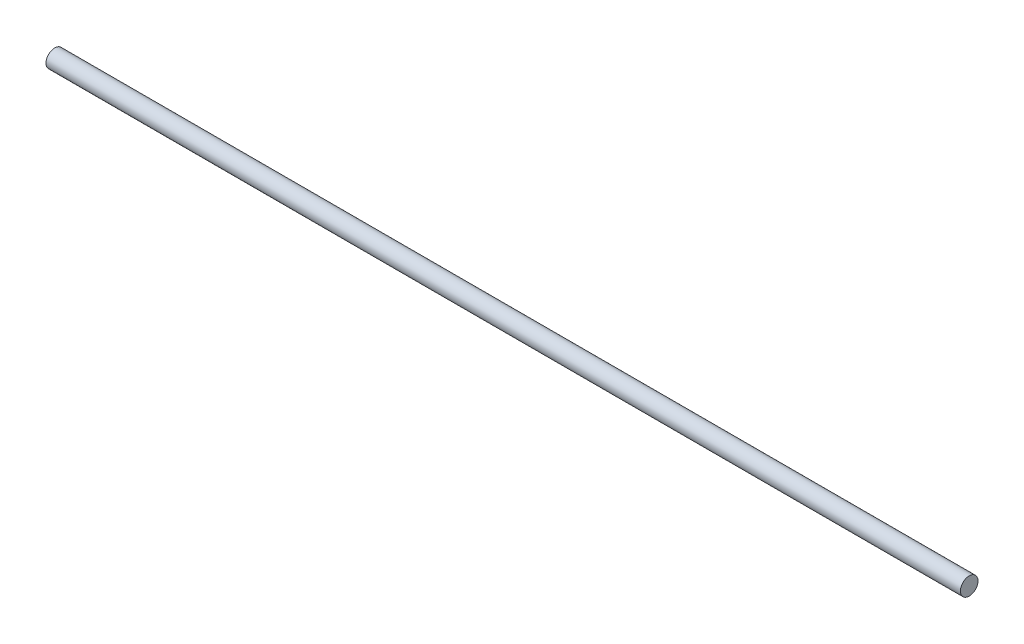
ISO-10303-21;
HEADER;
FILE_DESCRIPTION(('STEP AP214'),'2;1');
FILE_NAME('part.step','',(''),(''),'','','');
FILE_SCHEMA(('AUTOMOTIVE_DESIGN { 1 0 10303 214 1 1 1 1 }'));
ENDSEC;
DATA;
#1=APPLICATION_CONTEXT('core data for automotive mechanical design processes');
#2=APPLICATION_PROTOCOL_DEFINITION('international standard','automotive_design',2000,#1);
#3=PRODUCT_CONTEXT('',#1,'mechanical');
#4=PRODUCT('Part','Part','',(#3));
#5=PRODUCT_RELATED_PRODUCT_CATEGORY('part','',(#4));
#6=PRODUCT_DEFINITION_FORMATION('','',#4);
#7=PRODUCT_DEFINITION_CONTEXT('part definition',#1,'design');
#8=PRODUCT_DEFINITION('design','',#6,#7);
#9=PRODUCT_DEFINITION_SHAPE('','',#8);
#10=(LENGTH_UNIT() NAMED_UNIT(*) SI_UNIT(.MILLI.,.METRE.));
#11=(NAMED_UNIT(*) PLANE_ANGLE_UNIT() SI_UNIT($,.RADIAN.));
#12=(NAMED_UNIT(*) SI_UNIT($,.STERADIAN.) SOLID_ANGLE_UNIT());
#13=UNCERTAINTY_MEASURE_WITH_UNIT(LENGTH_MEASURE(1.E-05),#10,'distance_accuracy_value','');
#14=(GEOMETRIC_REPRESENTATION_CONTEXT(3) GLOBAL_UNCERTAINTY_ASSIGNED_CONTEXT((#13)) GLOBAL_UNIT_ASSIGNED_CONTEXT((#10,
#11,#12)) REPRESENTATION_CONTEXT('',''));
#15=CARTESIAN_POINT('',(0.,0.,0.));
#16=DIRECTION('',(0.,0.,1.));
#17=DIRECTION('',(1.,0.,0.));
#18=AXIS2_PLACEMENT_3D('',#15,#16,#17);
#19=CARTESIAN_POINT('',(-520.,0.,0.));
#20=DIRECTION('',(1.,0.,0.));
#21=DIRECTION('',(0.,0.,-1.));
#22=AXIS2_PLACEMENT_3D('',#19,#20,#21);
#23=CYLINDRICAL_SURFACE('',#22,5.);
#24=CARTESIAN_POINT('',(-520.,0.,0.));
#25=DIRECTION('',(1.,0.,0.));
#26=DIRECTION('',(0.,0.,-1.));
#27=AXIS2_PLACEMENT_3D('',#24,#25,#26);
#28=CIRCLE('',#27,5.);
#29=CARTESIAN_POINT('',(-520.,0.,-5.));
#30=VERTEX_POINT('',#29);
#31=EDGE_CURVE('E10',#30,#30,#28,.T.);
#32=ORIENTED_EDGE('',*,*,#31,.T.);
#33=EDGE_LOOP('',(#32));
#34=FACE_BOUND('',#33,.T.);
#35=CARTESIAN_POINT('',(0.,0.,0.));
#36=DIRECTION('',(1.,0.,0.));
#37=DIRECTION('',(0.,0.,-1.));
#38=AXIS2_PLACEMENT_3D('',#35,#36,#37);
#39=CIRCLE('',#38,5.);
#40=CARTESIAN_POINT('',(0.,0.,-5.));
#41=VERTEX_POINT('',#40);
#42=EDGE_CURVE('E44',#41,#41,#39,.T.);
#43=ORIENTED_EDGE('',*,*,#42,.F.);
#44=EDGE_LOOP('',(#43));
#45=FACE_BOUND('',#44,.T.);
#46=ADVANCED_FACE('F41',(#34,#45),#23,.T.);
#47=CARTESIAN_POINT('',(-520.,0.,0.));
#48=DIRECTION('',(1.,0.,0.));
#49=DIRECTION('',(0.,0.,-1.));
#50=AXIS2_PLACEMENT_3D('',#47,#48,#49);
#51=PLANE('',#50);
#52=ORIENTED_EDGE('',*,*,#31,.F.);
#53=EDGE_LOOP('',(#52));
#54=FACE_BOUND('',#53,.T.);
#55=ADVANCED_FACE('F58',(#54),#51,.F.);
#56=CARTESIAN_POINT('',(0.,0.,0.));
#57=DIRECTION('',(1.,0.,0.));
#58=DIRECTION('',(0.,0.,-1.));
#59=AXIS2_PLACEMENT_3D('',#56,#57,#58);
#60=PLANE('',#59);
#61=ORIENTED_EDGE('',*,*,#42,.T.);
#62=EDGE_LOOP('',(#61));
#63=FACE_BOUND('',#62,.T.);
#64=ADVANCED_FACE('F55',(#63),#60,.T.);
#65=CLOSED_SHELL('',(#46,#55,#64));
#66=MANIFOLD_SOLID_BREP('B2',#65);
#67=ADVANCED_BREP_SHAPE_REPRESENTATION('',(#18,#66),#14);
#68=SHAPE_DEFINITION_REPRESENTATION(#9,#67);
ENDSEC;
END-ISO-10303-21;
